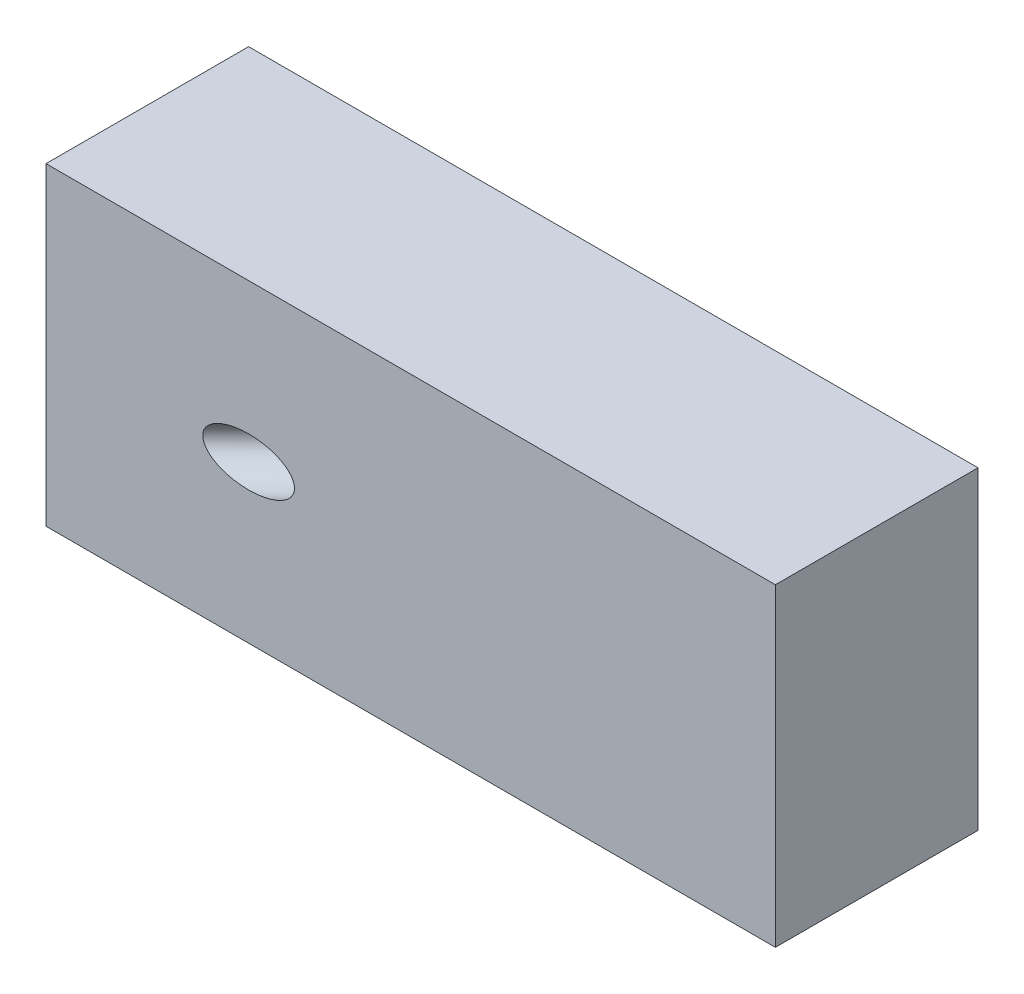
ISO-10303-21;
HEADER;
FILE_DESCRIPTION(('STEP AP214'),'2;1');
FILE_NAME('part.step','',(''),(''),'','','');
FILE_SCHEMA(('AUTOMOTIVE_DESIGN { 1 0 10303 214 1 1 1 1 }'));
ENDSEC;
DATA;
#1=APPLICATION_CONTEXT('core data for automotive mechanical design processes');
#2=APPLICATION_PROTOCOL_DEFINITION('international standard','automotive_design',2000,#1);
#3=PRODUCT_CONTEXT('',#1,'mechanical');
#4=PRODUCT('Part','Part','',(#3));
#5=PRODUCT_RELATED_PRODUCT_CATEGORY('part','',(#4));
#6=PRODUCT_DEFINITION_FORMATION('','',#4);
#7=PRODUCT_DEFINITION_CONTEXT('part definition',#1,'design');
#8=PRODUCT_DEFINITION('design','',#6,#7);
#9=PRODUCT_DEFINITION_SHAPE('','',#8);
#10=(LENGTH_UNIT() NAMED_UNIT(*) SI_UNIT(.MILLI.,.METRE.));
#11=(NAMED_UNIT(*) PLANE_ANGLE_UNIT() SI_UNIT($,.RADIAN.));
#12=(NAMED_UNIT(*) SI_UNIT($,.STERADIAN.) SOLID_ANGLE_UNIT());
#13=UNCERTAINTY_MEASURE_WITH_UNIT(LENGTH_MEASURE(1.E-05),#10,'distance_accuracy_value','');
#14=(GEOMETRIC_REPRESENTATION_CONTEXT(3) GLOBAL_UNCERTAINTY_ASSIGNED_CONTEXT((#13)) GLOBAL_UNIT_ASSIGNED_CONTEXT((#10,
#11,#12)) REPRESENTATION_CONTEXT('',''));
#15=CARTESIAN_POINT('',(0.,0.,0.));
#16=DIRECTION('',(0.,0.,1.));
#17=DIRECTION('',(1.,0.,0.));
#18=AXIS2_PLACEMENT_3D('',#15,#16,#17);
#19=CARTESIAN_POINT('',(0.,7.75,5.));
#20=DIRECTION('',(1.,0.,0.));
#21=DIRECTION('',(0.,1.,0.));
#22=AXIS2_PLACEMENT_3D('',#19,#20,#21);
#23=PLANE('',#22);
#24=DIRECTION('',(0.,-1.,0.));
#25=VECTOR('',#24,1.);
#26=CARTESIAN_POINT('',(0.,7.75,0.));
#27=LINE('',#26,#25);
#28=CARTESIAN_POINT('',(0.,7.75,0.));
#29=VERTEX_POINT('',#28);
#30=CARTESIAN_POINT('',(0.,0.,0.));
#31=VERTEX_POINT('',#30);
#32=EDGE_CURVE('E111',#29,#31,#27,.T.);
#33=ORIENTED_EDGE('',*,*,#32,.T.);
#34=DIRECTION('',(0.,0.,-1.));
#35=VECTOR('',#34,1.);
#36=CARTESIAN_POINT('',(0.,0.,5.));
#37=LINE('',#36,#35);
#38=CARTESIAN_POINT('',(0.,0.,5.));
#39=VERTEX_POINT('',#38);
#40=EDGE_CURVE('E100',#39,#31,#37,.T.);
#41=ORIENTED_EDGE('',*,*,#40,.F.);
#42=DIRECTION('',(0.,-1.,0.));
#43=VECTOR('',#42,1.);
#44=CARTESIAN_POINT('',(0.,7.75,5.));
#45=LINE('',#44,#43);
#46=CARTESIAN_POINT('',(0.,7.75,5.));
#47=VERTEX_POINT('',#46);
#48=EDGE_CURVE('E92',#47,#39,#45,.T.);
#49=ORIENTED_EDGE('',*,*,#48,.F.);
#50=DIRECTION('',(0.,0.,-1.));
#51=VECTOR('',#50,1.);
#52=CARTESIAN_POINT('',(0.,7.75,5.));
#53=LINE('',#52,#51);
#54=EDGE_CURVE('E107',#47,#29,#53,.T.);
#55=ORIENTED_EDGE('',*,*,#54,.T.);
#56=EDGE_LOOP('',(#33,#41,#49,#55));
#57=FACE_BOUND('',#56,.T.);
#58=ADVANCED_FACE('F39',(#57),#23,.F.);
#59=CARTESIAN_POINT('',(0.,0.,5.));
#60=DIRECTION('',(0.,1.,0.));
#61=DIRECTION('',(0.,0.,1.));
#62=AXIS2_PLACEMENT_3D('',#59,#60,#61);
#63=PLANE('',#62);
#64=DIRECTION('',(1.,0.,0.));
#65=VECTOR('',#64,1.);
#66=CARTESIAN_POINT('',(0.,0.,0.));
#67=LINE('',#66,#65);
#68=CARTESIAN_POINT('',(18.,0.,0.));
#69=VERTEX_POINT('',#68);
#70=EDGE_CURVE('E98',#31,#69,#67,.T.);
#71=ORIENTED_EDGE('',*,*,#70,.T.);
#72=DIRECTION('',(0.,0.,-1.));
#73=VECTOR('',#72,1.);
#74=CARTESIAN_POINT('',(18.,0.,5.));
#75=LINE('',#74,#73);
#76=CARTESIAN_POINT('',(18.,0.,5.));
#77=VERTEX_POINT('',#76);
#78=EDGE_CURVE('E96',#77,#69,#75,.T.);
#79=ORIENTED_EDGE('',*,*,#78,.F.);
#80=DIRECTION('',(1.,0.,0.));
#81=VECTOR('',#80,1.);
#82=CARTESIAN_POINT('',(0.,0.,5.));
#83=LINE('',#82,#81);
#84=EDGE_CURVE('E87',#39,#77,#83,.T.);
#85=ORIENTED_EDGE('',*,*,#84,.F.);
#86=ORIENTED_EDGE('',*,*,#40,.T.);
#87=EDGE_LOOP('',(#71,#79,#85,#86));
#88=FACE_BOUND('',#87,.T.);
#89=ADVANCED_FACE('F97',(#88),#63,.F.);
#90=CARTESIAN_POINT('',(18.,7.75,5.));
#91=DIRECTION('',(-1.,0.,0.));
#92=DIRECTION('',(0.,0.,1.));
#93=AXIS2_PLACEMENT_3D('',#90,#91,#92);
#94=PLANE('',#93);
#95=DIRECTION('',(0.,1.,0.));
#96=VECTOR('',#95,1.);
#97=CARTESIAN_POINT('',(18.,7.75,0.));
#98=LINE('',#97,#96);
#99=CARTESIAN_POINT('',(18.,7.75,0.));
#100=VERTEX_POINT('',#99);
#101=EDGE_CURVE('E73',#69,#100,#98,.T.);
#102=ORIENTED_EDGE('',*,*,#101,.T.);
#103=DIRECTION('',(0.,0.,-1.));
#104=VECTOR('',#103,1.);
#105=CARTESIAN_POINT('',(18.,7.75,5.));
#106=LINE('',#105,#104);
#107=CARTESIAN_POINT('',(18.,7.75,5.));
#108=VERTEX_POINT('',#107);
#109=EDGE_CURVE('E101',#108,#100,#106,.T.);
#110=ORIENTED_EDGE('',*,*,#109,.F.);
#111=DIRECTION('',(0.,1.,0.));
#112=VECTOR('',#111,1.);
#113=CARTESIAN_POINT('',(18.,7.75,5.));
#114=LINE('',#113,#112);
#115=EDGE_CURVE('E90',#77,#108,#114,.T.);
#116=ORIENTED_EDGE('',*,*,#115,.F.);
#117=ORIENTED_EDGE('',*,*,#78,.T.);
#118=EDGE_LOOP('',(#102,#110,#116,#117));
#119=FACE_BOUND('',#118,.T.);
#120=ADVANCED_FACE('F103',(#119),#94,.F.);
#121=CARTESIAN_POINT('',(0.,7.75,5.));
#122=DIRECTION('',(0.,-1.,0.));
#123=DIRECTION('',(1.,0.,0.));
#124=AXIS2_PLACEMENT_3D('',#121,#122,#123);
#125=PLANE('',#124);
#126=DIRECTION('',(-1.,0.,0.));
#127=VECTOR('',#126,1.);
#128=CARTESIAN_POINT('',(0.,7.75,0.));
#129=LINE('',#128,#127);
#130=EDGE_CURVE('E79',#100,#29,#129,.T.);
#131=ORIENTED_EDGE('',*,*,#130,.T.);
#132=ORIENTED_EDGE('',*,*,#54,.F.);
#133=DIRECTION('',(-1.,0.,0.));
#134=VECTOR('',#133,1.);
#135=CARTESIAN_POINT('',(0.,7.75,5.));
#136=LINE('',#135,#134);
#137=EDGE_CURVE('E56',#108,#47,#136,.T.);
#138=ORIENTED_EDGE('',*,*,#137,.F.);
#139=ORIENTED_EDGE('',*,*,#109,.T.);
#140=EDGE_LOOP('',(#131,#132,#138,#139));
#141=FACE_BOUND('',#140,.T.);
#142=ADVANCED_FACE('F186',(#141),#125,.F.);
#143=CARTESIAN_POINT('',(0.,0.,5.));
#144=DIRECTION('',(0.,0.,1.));
#145=DIRECTION('',(1.,0.,0.));
#146=AXIS2_PLACEMENT_3D('',#143,#144,#145);
#147=PLANE('',#146);
#148=CARTESIAN_POINT('',(3.86862915010152,3.875,5.));
#149=CARTESIAN_POINT('',(3.86862771781144,3.85440427053259,4.99999999999934));
#150=CARTESIAN_POINT('',(3.87064904998851,3.83381253152308,4.99999999999983));
#151=CARTESIAN_POINT('',(3.87828151289731,3.79445368255573,5.00000000000016));
#152=CARTESIAN_POINT('',(3.88369744339823,3.77564764084009,5.00000000000003));
#153=CARTESIAN_POINT('',(3.89746280961916,3.73911632220586,4.99999999999997));
#154=CARTESIAN_POINT('',(3.90581926729342,3.72139375257617,5.00000000000004));
#155=CARTESIAN_POINT('',(3.92897842389906,3.67999530683745,5.00000000000009));
#156=CARTESIAN_POINT('',(3.94500987337502,3.65701096191798,5.00000000000002));
#157=CARTESIAN_POINT('',(3.98044493349899,3.61385047591323,4.99999999999998));
#158=CARTESIAN_POINT('',(3.99985410175264,3.59367906325355,4.99999999999999));
#159=CARTESIAN_POINT('',(4.0539639237191,3.54401205277469,5.00000000000001));
#160=CARTESIAN_POINT('',(4.09060078894685,3.51663757914364,5.));
#161=CARTESIAN_POINT('',(4.15656576453623,3.47444070244602,5.));
#162=CARTESIAN_POINT('',(4.18506856237652,3.45824975928616,5.));
#163=CARTESIAN_POINT('',(4.24339737797011,3.4283896871433,5.));
#164=CARTESIAN_POINT('',(4.27322454862745,3.41472281102097,5.00000000000001));
#165=CARTESIAN_POINT('',(4.36388323284515,3.37715299400843,4.99999999999998));
#166=CARTESIAN_POINT('',(4.42608904977915,3.35656302242009,4.9999999999999));
#167=CARTESIAN_POINT('',(4.55231662856689,3.32270262575681,5.00000000000009));
#168=CARTESIAN_POINT('',(4.61633691612691,3.30942642776105,5.00000000000036));
#169=CARTESIAN_POINT('',(4.74534589598778,3.28931121436708,5.00000000000038));
#170=CARTESIAN_POINT('',(4.81033425711425,3.28247004670977,5.00000000000013));
#171=CARTESIAN_POINT('',(4.94064690133433,3.27481893222654,4.99999999999987));
#172=CARTESIAN_POINT('',(5.00597114349214,3.27400826708225,4.99999999999987));
#173=CARTESIAN_POINT('',(5.13642676433502,3.27837032045173,5.00000000000013));
#174=CARTESIAN_POINT('',(5.20155813759386,3.28354320573447,5.0000000000004));
#175=CARTESIAN_POINT('',(5.33104292220161,3.30017229572099,4.99999999999959));
#176=CARTESIAN_POINT('',(5.39539618331134,3.31162969465698,4.99999999999851));
#177=CARTESIAN_POINT('',(5.52253558881927,3.34154802783353,4.99999999999854));
#178=CARTESIAN_POINT('',(5.58532098308163,3.360012248521,4.99999999999965));
#179=CARTESIAN_POINT('',(5.69766267867394,3.40150761574939,5.0000000000003));
#180=CARTESIAN_POINT('',(5.747677404853,3.42326139800653,5.00000000000007));
#181=CARTESIAN_POINT('',(5.83371340200536,3.46842031128329,4.99999999999995));
#182=CARTESIAN_POINT('',(5.87043663553532,3.49047262408321,4.99999999999999));
#183=CARTESIAN_POINT('',(5.9402090169547,3.53984730526338,5.00000000000001));
#184=CARTESIAN_POINT('',(5.97326668048278,3.56715703774548,4.99999999999999));
#185=CARTESIAN_POINT('',(6.01988856892462,3.61458293326345,4.99999999999999));
#186=CARTESIAN_POINT('',(6.03561982495067,3.63255938354888,5.));
#187=CARTESIAN_POINT('',(6.0643879335086,3.67058679653031,5.));
#188=CARTESIAN_POINT('',(6.07742635071322,3.69063654431581,5.));
#189=CARTESIAN_POINT('',(6.09801430591019,3.72923363502214,5.));
#190=CARTESIAN_POINT('',(6.10611433831836,3.74748387936195,5.));
#191=CARTESIAN_POINT('',(6.11916285947115,3.78505400063874,5.));
#192=CARTESIAN_POINT('',(6.12411895482478,3.80437117202148,5.));
#193=CARTESIAN_POINT('',(6.13045145380992,3.84373875366441,5.));
#194=CARTESIAN_POINT('',(6.13180220850752,3.86379339404008,5.));
#195=CARTESIAN_POINT('',(6.13069640141744,3.90379598556343,5.));
#196=CARTESIAN_POINT('',(6.12823986229652,3.92374393734558,4.99999999999999));
#197=CARTESIAN_POINT('',(6.12020780210247,3.96093845888433,5.00000000000001));
#198=CARTESIAN_POINT('',(6.11496098384768,3.9782583681045,5.00000000000004));
#199=CARTESIAN_POINT('',(6.10198015020035,4.01195951213336,4.99999999999996));
#200=CARTESIAN_POINT('',(6.09424133943025,4.02833886482123,4.99999999999987));
#201=CARTESIAN_POINT('',(6.07201867173172,4.0684484456387,4.99999999999981));
#202=CARTESIAN_POINT('',(6.0561438021196,4.09140643561869,4.99999999999995));
#203=CARTESIAN_POINT('',(6.02101346199726,4.13453866322175,5.00000000000005));
#204=CARTESIAN_POINT('',(6.00175130712747,4.15470725307434,5.00000000000002));
#205=CARTESIAN_POINT('',(5.94811577371452,4.20429238214489,4.99999999999998));
#206=CARTESIAN_POINT('',(5.91181859821304,4.23161687682577,4.99999999999999));
#207=CARTESIAN_POINT('',(5.84644823598127,4.27376124379923,5.00000000000001));
#208=CARTESIAN_POINT('',(5.81820087067007,4.28993956283922,5.));
#209=CARTESIAN_POINT('',(5.76038262748319,4.31979635621714,5.));
#210=CARTESIAN_POINT('',(5.73081057714239,4.33347255927505,4.99999999999999));
#211=CARTESIAN_POINT('',(5.64091415059498,4.37109798415276,5.00000000000002));
#212=CARTESIAN_POINT('',(5.57921354686625,4.39176209757105,5.00000000000011));
#213=CARTESIAN_POINT('',(5.45398565843377,4.4258358913377,4.9999999999999));
#214=CARTESIAN_POINT('',(5.39045986274137,4.43925131765937,4.99999999999959));
#215=CARTESIAN_POINT('',(5.26242563069303,4.45971105140421,4.99999999999958));
#216=CARTESIAN_POINT('',(5.19791753369751,4.46675751054957,4.99999999999987));
#217=CARTESIAN_POINT('',(5.06854590464182,4.47489280424284,5.00000000000013));
#218=CARTESIAN_POINT('',(5.00368241751442,4.47598237529405,5.00000000000011));
#219=CARTESIAN_POINT('',(4.87411689140049,4.47226638487764,4.99999999999989));
#220=CARTESIAN_POINT('',(4.80941485571514,4.46746070384405,4.9999999999997));
#221=CARTESIAN_POINT('',(4.6807469611195,4.45168141288176,5.00000000000031));
#222=CARTESIAN_POINT('',(4.61678123310498,4.44070672303541,5.00000000000112));
#223=CARTESIAN_POINT('',(4.49031059836946,4.4119099819334,5.00000000000106));
#224=CARTESIAN_POINT('',(4.4278063392799,4.39408495383538,5.0000000000002));
#225=CARTESIAN_POINT('',(4.33617824422928,4.36125600296638,4.9999999999999));
#226=CARTESIAN_POINT('',(4.30596394471828,4.349284214991,4.99999999999997));
#227=CARTESIAN_POINT('',(4.24654727385538,4.32305970892369,5.00000000000003));
#228=CARTESIAN_POINT('',(4.21734485460437,4.30880709897838,5.00000000000001));
#229=CARTESIAN_POINT('',(4.14699805246767,4.27044314000949,4.99999999999998));
#230=CARTESIAN_POINT('',(4.10662224158329,4.24483087720328,4.99999999999998));
#231=CARTESIAN_POINT('',(4.05465874401162,4.20489346376582,5.));
#232=CARTESIAN_POINT('',(4.04081211373804,4.19348212893077,5.00000000000001));
#233=CARTESIAN_POINT('',(4.01402363610118,4.1695794615998,4.99999999999999));
#234=CARTESIAN_POINT('',(4.00108392666865,4.15708572279586,4.99999999999996));
#235=CARTESIAN_POINT('',(3.96903555987251,4.12320597504996,5.00000000000006));
#236=CARTESIAN_POINT('',(3.95082471758196,4.10094398456574,5.00000000000029));
#237=CARTESIAN_POINT('',(3.9188130933924,4.05348516535344,4.99999999999971));
#238=CARTESIAN_POINT('',(3.90499340873262,4.02830157122629,4.9999999999989));
#239=CARTESIAN_POINT('',(3.88616261780664,3.98214143524395,5.00000000000083));
#240=CARTESIAN_POINT('',(3.87980595805228,3.96171992174369,5.00000000000272));
#241=CARTESIAN_POINT('',(3.87096284855341,3.91921969519198,5.00000000000273));
#242=CARTESIAN_POINT('',(3.86863068752815,3.89710754869873,5.0000000000007));
#243=CARTESIAN_POINT('',(3.86862915010152,3.875,5.));
#244=B_SPLINE_CURVE_WITH_KNOTS('',3,(#148,#149,#150,#151,#152,#153,#154,#155,#156,#157,#158,
#159,#160,#161,#162,#163,#164,#165,#166,#167,#168,#169,#170,#171,#172,#173,#174,#175,#176,#177,
#178,#179,#180,#181,#182,#183,#184,#185,#186,#187,#188,#189,#190,#191,#192,#193,#194,#195,#196,
#197,#198,#199,#200,#201,#202,#203,#204,#205,#206,#207,#208,#209,#210,#211,#212,#213,#214,#215,
#216,#217,#218,#219,#220,#221,#222,#223,#224,#225,#226,#227,#228,#229,#230,#231,#232,#233,#234,
#235,#236,#237,#238,#239,#240,#241,#242,#243),.UNSPECIFIED.,.T.,.F.,(4,2,2,2,2,2,2,2,2,2,2,2,2,
2,2,2,2,2,2,2,2,2,2,2,2,2,2,2,2,2,2,2,2,2,2,2,2,2,2,2,2,2,2,2,2,2,2,4),(0.,0.0616871998823941,
0.120116930941494,0.178687149331705,0.262281226560215,0.346014170563411,0.482443287356364,
0.580678102179316,0.679000177341814,0.874962889227487,1.07077070103948,1.26651299969528,
1.4622319822944,1.65795641995553,1.85371806358937,2.04957164006456,2.21272243142616,
2.34091145280605,2.46879614147404,2.540277227319,2.6117166615307,2.67138059668041,
2.73089962155164,2.79084095895341,2.85078193949527,2.90485786161377,2.9590384709791,
3.04229480187453,3.12571731054712,3.261245724081,3.35879682609658,3.45643604484919,
3.65103568890563,3.84548084830786,4.03986029085041,4.23421569998137,4.4285750510431,
4.62296843633826,4.81744639176348,4.91486144495557,5.01227188051831,5.15502480704984,
5.2088092776206,5.26271654599943,5.34862465900622,5.43415778668831,5.49797671240445,
5.56419203037346),.UNSPECIFIED.);
#245=CARTESIAN_POINT('',(3.86862915010152,3.875,5.));
#246=VERTEX_POINT('',#245);
#247=EDGE_CURVE('E115',#246,#246,#244,.T.);
#248=ORIENTED_EDGE('',*,*,#247,.F.);
#249=EDGE_LOOP('',(#248));
#250=FACE_BOUND('',#249,.T.);
#251=ORIENTED_EDGE('',*,*,#48,.T.);
#252=ORIENTED_EDGE('',*,*,#84,.T.);
#253=ORIENTED_EDGE('',*,*,#115,.T.);
#254=ORIENTED_EDGE('',*,*,#137,.T.);
#255=EDGE_LOOP('',(#251,#252,#253,#254));
#256=FACE_BOUND('',#255,.T.);
#257=ADVANCED_FACE('F88',(#250,#256),#147,.T.);
#258=CARTESIAN_POINT('',(0.,0.,0.));
#259=DIRECTION('',(0.,0.,1.));
#260=DIRECTION('',(1.,0.,0.));
#261=AXIS2_PLACEMENT_3D('',#258,#259,#260);
#262=PLANE('',#261);
#263=CARTESIAN_POINT('',(11.7292361250002,2.125,0.));
#264=DIRECTION('',(0.,0.,1.));
#265=DIRECTION('',(1.,0.,0.));
#266=AXIS2_PLACEMENT_3D('',#263,#264,#265);
#267=CIRCLE('',#266,0.25);
#268=CARTESIAN_POINT('',(11.9792361250002,2.125,0.));
#269=VERTEX_POINT('',#268);
#270=EDGE_CURVE('E11',#269,#269,#267,.F.);
#271=ORIENTED_EDGE('',*,*,#270,.F.);
#272=EDGE_LOOP('',(#271));
#273=FACE_BOUND('',#272,.T.);
#274=CARTESIAN_POINT('',(11.7292361250002,5.625,0.));
#275=DIRECTION('',(0.,0.,1.));
#276=DIRECTION('',(1.,0.,0.));
#277=AXIS2_PLACEMENT_3D('',#274,#275,#276);
#278=CIRCLE('',#277,0.25);
#279=CARTESIAN_POINT('',(11.9792361250002,5.625,0.));
#280=VERTEX_POINT('',#279);
#281=EDGE_CURVE('E48',#280,#280,#278,.F.);
#282=ORIENTED_EDGE('',*,*,#281,.F.);
#283=EDGE_LOOP('',(#282));
#284=FACE_BOUND('',#283,.T.);
#285=CARTESIAN_POINT('',(8.86862915010152,3.875,0.));
#286=CARTESIAN_POINT('',(8.86862771781143,3.85440427053259,-6.5479621180761E-13));
#287=CARTESIAN_POINT('',(8.87064904998851,3.83381253152308,-1.67269497313426E-13));
#288=CARTESIAN_POINT('',(8.87828151289731,3.79445368255573,1.58436624794894E-13));
#289=CARTESIAN_POINT('',(8.88369744339823,3.77564764084009,0.));
#290=CARTESIAN_POINT('',(8.89746280961916,3.73911632220586,0.));
#291=CARTESIAN_POINT('',(8.90581926729342,3.72139375257617,0.));
#292=CARTESIAN_POINT('',(8.92897842389906,3.67999530683745,0.));
#293=CARTESIAN_POINT('',(8.94500987337502,3.65701096191798,0.));
#294=CARTESIAN_POINT('',(8.98044493349899,3.61385047591323,0.));
#295=CARTESIAN_POINT('',(8.99985410175264,3.59367906325355,0.));
#296=CARTESIAN_POINT('',(9.0539639237191,3.54401205277469,0.));
#297=CARTESIAN_POINT('',(9.09060078894685,3.51663757914364,0.));
#298=CARTESIAN_POINT('',(9.15656576453623,3.47444070244602,0.));
#299=CARTESIAN_POINT('',(9.18506856237652,3.45824975928616,0.));
#300=CARTESIAN_POINT('',(9.24339737797012,3.4283896871433,0.));
#301=CARTESIAN_POINT('',(9.27322454862745,3.41472281102097,0.));
#302=CARTESIAN_POINT('',(9.36388323284515,3.37715299400843,0.));
#303=CARTESIAN_POINT('',(9.42608904977915,3.35656302242009,0.));
#304=CARTESIAN_POINT('',(9.55231662856689,3.32270262575681,0.));
#305=CARTESIAN_POINT('',(9.61633691612691,3.30942642776104,3.6415488403388E-13));
#306=CARTESIAN_POINT('',(9.74534589598778,3.28931121436707,3.78304396224251E-13));
#307=CARTESIAN_POINT('',(9.81033425711425,3.28247004670977,1.2385126040534E-13));
#308=CARTESIAN_POINT('',(9.94064690133434,3.27481893222654,-1.30774988364794E-13));
#309=CARTESIAN_POINT('',(10.0059711434921,3.27400826708225,-1.30978386546999E-13));
#310=CARTESIAN_POINT('',(10.136426764335,3.27837032045173,1.30982037164892E-13));
#311=CARTESIAN_POINT('',(10.2015581375939,3.28354320573447,3.93153171734876E-13));
#312=CARTESIAN_POINT('',(10.3310429222016,3.30017229572099,-4.14046567927456E-13));
#313=CARTESIAN_POINT('',(10.3953961833113,3.31162969465698,-1.48367056931383E-12));
#314=CARTESIAN_POINT('',(10.5225355888193,3.34154802783353,-1.45147399379676E-12));
#315=CARTESIAN_POINT('',(10.5853209830816,3.36001224852101,-3.48633435423833E-13));
#316=CARTESIAN_POINT('',(10.6976626786739,3.4015076157494,2.96779709313103E-13));
#317=CARTESIAN_POINT('',(10.747677404853,3.42326139800653,0.));
#318=CARTESIAN_POINT('',(10.8337134020054,3.46842031128329,0.));
#319=CARTESIAN_POINT('',(10.8704366355353,3.49047262408322,0.));
#320=CARTESIAN_POINT('',(10.9402090169547,3.53984730526338,0.));
#321=CARTESIAN_POINT('',(10.9732666804828,3.56715703774548,0.));
#322=CARTESIAN_POINT('',(11.0198885689246,3.61458293326345,0.));
#323=CARTESIAN_POINT('',(11.0356198249507,3.63255938354888,0.));
#324=CARTESIAN_POINT('',(11.0643879335086,3.67058679653031,0.));
#325=CARTESIAN_POINT('',(11.0774263507132,3.69063654431581,0.));
#326=CARTESIAN_POINT('',(11.0980143059102,3.72923363502215,0.));
#327=CARTESIAN_POINT('',(11.1061143383184,3.74748387936196,0.));
#328=CARTESIAN_POINT('',(11.1191628594711,3.78505400063875,0.));
#329=CARTESIAN_POINT('',(11.1241189548248,3.80437117202149,0.));
#330=CARTESIAN_POINT('',(11.1304514538099,3.84373875366441,0.));
#331=CARTESIAN_POINT('',(11.1318022085075,3.86379339404008,0.));
#332=CARTESIAN_POINT('',(11.1306964014174,3.90379598556344,0.));
#333=CARTESIAN_POINT('',(11.1282398622965,3.92374393734558,0.));
#334=CARTESIAN_POINT('',(11.1202078021025,3.96093845888433,0.));
#335=CARTESIAN_POINT('',(11.1149609838477,3.97825836810451,0.));
#336=CARTESIAN_POINT('',(11.1019801502003,4.01195951213336,0.));
#337=CARTESIAN_POINT('',(11.0942413394303,4.02833886482123,-1.30010710124403E-13));
#338=CARTESIAN_POINT('',(11.0720186717317,4.0684484456387,-1.87452910732065E-13));
#339=CARTESIAN_POINT('',(11.0561438021196,4.09140643561869,0.));
#340=CARTESIAN_POINT('',(11.0210134619973,4.13453866322175,0.));
#341=CARTESIAN_POINT('',(11.0017513071275,4.15470725307434,0.));
#342=CARTESIAN_POINT('',(10.9481157737145,4.20429238214489,0.));
#343=CARTESIAN_POINT('',(10.911818598213,4.23161687682577,0.));
#344=CARTESIAN_POINT('',(10.8464482359813,4.27376124379923,0.));
#345=CARTESIAN_POINT('',(10.8182008706701,4.28993956283923,0.));
#346=CARTESIAN_POINT('',(10.7603826274832,4.31979635621714,0.));
#347=CARTESIAN_POINT('',(10.7308105771424,4.33347255927505,0.));
#348=CARTESIAN_POINT('',(10.640914150595,4.37109798415276,0.));
#349=CARTESIAN_POINT('',(10.5792135468662,4.39176209757105,1.06948254897137E-13));
#350=CARTESIAN_POINT('',(10.4539856584338,4.4258358913377,-1.06863353075986E-13));
#351=CARTESIAN_POINT('',(10.3904598627414,4.43925131765937,-4.06885500783275E-13));
#352=CARTESIAN_POINT('',(10.262425630693,4.45971105140421,-4.18840853157963E-13));
#353=CARTESIAN_POINT('',(10.1979175336975,4.46675751054957,-1.30972780668668E-13));
#354=CARTESIAN_POINT('',(10.0685459046418,4.47489280424284,1.30956586966797E-13));
#355=CARTESIAN_POINT('',(10.0036824175144,4.47598237529405,1.05056677326726E-13));
#356=CARTESIAN_POINT('',(9.87411689140048,4.47226638487764,-1.11997772365498E-13));
#357=CARTESIAN_POINT('',(9.80941485571513,4.46746070384405,-3.03155664113611E-13));
#358=CARTESIAN_POINT('',(9.68074696111949,4.45168141288175,3.10148251089395E-13));
#359=CARTESIAN_POINT('',(9.61678123310497,4.44070672303541,1.11478440670087E-12));
#360=CARTESIAN_POINT('',(9.49031059836945,4.4119099819334,1.05707683521823E-12));
#361=CARTESIAN_POINT('',(9.42780633927989,4.39408495383537,1.94007742343815E-13));
#362=CARTESIAN_POINT('',(9.33617824422927,4.36125600296637,0.));
#363=CARTESIAN_POINT('',(9.30596394471827,4.349284214991,0.));
#364=CARTESIAN_POINT('',(9.24654727385537,4.32305970892368,0.));
#365=CARTESIAN_POINT('',(9.21734485460436,4.30880709897837,0.));
#366=CARTESIAN_POINT('',(9.14699805246765,4.27044314000949,0.));
#367=CARTESIAN_POINT('',(9.10662224158328,4.24483087720327,0.));
#368=CARTESIAN_POINT('',(9.05465874401161,4.20489346376582,0.));
#369=CARTESIAN_POINT('',(9.04081211373804,4.19348212893077,0.));
#370=CARTESIAN_POINT('',(9.01402363610118,4.16957946159979,0.));
#371=CARTESIAN_POINT('',(9.00108392666865,4.15708572279585,0.));
#372=CARTESIAN_POINT('',(8.9690355598725,4.12320597504996,0.));
#373=CARTESIAN_POINT('',(8.95082471758196,4.10094398456574,2.92254577608635E-13));
#374=CARTESIAN_POINT('',(8.9188130933924,4.05348516535344,-2.90978898585473E-13));
#375=CARTESIAN_POINT('',(8.90499340873262,4.02830157122628,-1.09993155156908E-12));
#376=CARTESIAN_POINT('',(8.88616261780664,3.98214143524395,8.26751235751569E-13));
#377=CARTESIAN_POINT('',(8.87980595805228,3.96171992174369,2.71466248985615E-12));
#378=CARTESIAN_POINT('',(8.87096284855341,3.91921969519197,2.72563249631167E-12));
#379=CARTESIAN_POINT('',(8.86863068752815,3.89710754869873,7.04659592310698E-13));
#380=CARTESIAN_POINT('',(8.86862915010152,3.875,0.));
#381=B_SPLINE_CURVE_WITH_KNOTS('',3,(#285,#286,#287,#288,#289,#290,#291,#292,#293,#294,#295,
#296,#297,#298,#299,#300,#301,#302,#303,#304,#305,#306,#307,#308,#309,#310,#311,#312,#313,#314,
#315,#316,#317,#318,#319,#320,#321,#322,#323,#324,#325,#326,#327,#328,#329,#330,#331,#332,#333,
#334,#335,#336,#337,#338,#339,#340,#341,#342,#343,#344,#345,#346,#347,#348,#349,#350,#351,#352,
#353,#354,#355,#356,#357,#358,#359,#360,#361,#362,#363,#364,#365,#366,#367,#368,#369,#370,#371,
#372,#373,#374,#375,#376,#377,#378,#379,#380),.UNSPECIFIED.,.T.,.F.,(4,2,2,2,2,2,2,2,2,2,2,2,2,
2,2,2,2,2,2,2,2,2,2,2,2,2,2,2,2,2,2,2,2,2,2,2,2,2,2,2,2,2,2,2,2,2,2,4),(0.,0.0616871998823934,
0.120116930941494,0.178687149331704,0.262281226560216,0.346014170563414,0.482443287356364,
0.580678102179318,0.679000177341816,0.874962889227493,1.07077070103949,1.26651299969529,
1.46223198229441,1.65795641995554,1.85371806358939,2.04957164006457,2.21272243142616,
2.34091145280606,2.46879614147404,2.54027722731901,2.6117166615307,2.67138059668041,
2.73089962155165,2.79084095895342,2.85078193949527,2.90485786161378,2.9590384709791,
3.04229480187453,3.12571731054713,3.26124572408101,3.35879682609659,3.4564360448492,
3.65103568890564,3.84548084830787,4.03986029085041,4.23421569998138,4.42857505104311,
4.62296843633827,4.81744639176349,4.91486144495558,5.01227188051833,5.15502480704985,
5.20880927762061,5.26271654599943,5.34862465900623,5.43415778668831,5.49797671240446,
5.56419203037346),.UNSPECIFIED.);
#382=CARTESIAN_POINT('',(8.86862915010152,3.875,0.));
#383=VERTEX_POINT('',#382);
#384=EDGE_CURVE('E128',#383,#383,#381,.T.);
#385=ORIENTED_EDGE('',*,*,#384,.T.);
#386=EDGE_LOOP('',(#385));
#387=FACE_BOUND('',#386,.T.);
#388=ORIENTED_EDGE('',*,*,#32,.F.);
#389=ORIENTED_EDGE('',*,*,#130,.F.);
#390=ORIENTED_EDGE('',*,*,#101,.F.);
#391=ORIENTED_EDGE('',*,*,#70,.F.);
#392=EDGE_LOOP('',(#388,#389,#390,#391));
#393=FACE_BOUND('',#392,.T.);
#394=ADVANCED_FACE('F137',(#273,#284,#387,#393),#262,.F.);
#395=CARTESIAN_POINT('',(-2.07106781186548,3.875,12.0710678118655));
#396=DIRECTION('',(0.707106781186547,0.,-0.707106781186548));
#397=DIRECTION('',(-0.707106781186548,0.,-0.707106781186547));
#398=AXIS2_PLACEMENT_3D('',#395,#396,#397);
#399=ELLIPSE('',#398,0.8,0.6);
#400=DIRECTION('',(0.707106781186547,0.,-0.707106781186548));
#401=VECTOR('',#400,1.);
#402=SURFACE_OF_LINEAR_EXTRUSION('',#399,#401);
#403=ORIENTED_EDGE('',*,*,#247,.T.);
#404=EDGE_LOOP('',(#403));
#405=FACE_BOUND('',#404,.T.);
#406=ORIENTED_EDGE('',*,*,#384,.F.);
#407=EDGE_LOOP('',(#406));
#408=FACE_BOUND('',#407,.T.);
#409=ADVANCED_FACE('F141',(#405,#408),#402,.F.);
#410=CARTESIAN_POINT('',(11.7292361250002,5.625,-0.5));
#411=DIRECTION('',(0.,0.,1.));
#412=DIRECTION('',(1.,0.,0.));
#413=AXIS2_PLACEMENT_3D('',#410,#411,#412);
#414=CYLINDRICAL_SURFACE('',#413,0.25);
#415=CARTESIAN_POINT('',(11.7292361250002,5.625,-0.5));
#416=DIRECTION('',(0.,0.,-1.));
#417=DIRECTION('',(-1.,0.,0.));
#418=AXIS2_PLACEMENT_3D('',#415,#416,#417);
#419=CIRCLE('',#418,0.25);
#420=CARTESIAN_POINT('',(11.4792361250002,5.625,-0.5));
#421=VERTEX_POINT('',#420);
#422=EDGE_CURVE('E136',#421,#421,#419,.T.);
#423=ORIENTED_EDGE('',*,*,#422,.F.);
#424=EDGE_LOOP('',(#423));
#425=FACE_BOUND('',#424,.T.);
#426=ORIENTED_EDGE('',*,*,#281,.T.);
#427=EDGE_LOOP('',(#426));
#428=FACE_BOUND('',#427,.T.);
#429=ADVANCED_FACE('F146',(#425,#428),#414,.T.);
#430=CARTESIAN_POINT('',(11.7292361250002,5.625,-0.5));
#431=DIRECTION('',(0.,0.,-1.));
#432=DIRECTION('',(-1.,0.,0.));
#433=AXIS2_PLACEMENT_3D('',#430,#431,#432);
#434=PLANE('',#433);
#435=ORIENTED_EDGE('',*,*,#422,.T.);
#436=EDGE_LOOP('',(#435));
#437=FACE_BOUND('',#436,.T.);
#438=ADVANCED_FACE('F173',(#437),#434,.T.);
#439=CARTESIAN_POINT('',(11.7292361250002,2.125,-0.5));
#440=DIRECTION('',(0.,0.,1.));
#441=DIRECTION('',(1.,0.,0.));
#442=AXIS2_PLACEMENT_3D('',#439,#440,#441);
#443=CYLINDRICAL_SURFACE('',#442,0.25);
#444=CARTESIAN_POINT('',(11.7292361250002,2.125,-0.5));
#445=DIRECTION('',(0.,0.,-1.));
#446=DIRECTION('',(-1.,0.,0.));
#447=AXIS2_PLACEMENT_3D('',#444,#445,#446);
#448=CIRCLE('',#447,0.25);
#449=CARTESIAN_POINT('',(11.4792361250002,2.125,-0.5));
#450=VERTEX_POINT('',#449);
#451=EDGE_CURVE('E164',#450,#450,#448,.T.);
#452=ORIENTED_EDGE('',*,*,#451,.F.);
#453=EDGE_LOOP('',(#452));
#454=FACE_BOUND('',#453,.T.);
#455=ORIENTED_EDGE('',*,*,#270,.T.);
#456=EDGE_LOOP('',(#455));
#457=FACE_BOUND('',#456,.T.);
#458=ADVANCED_FACE('F170',(#454,#457),#443,.T.);
#459=CARTESIAN_POINT('',(11.7292361250002,2.125,-0.5));
#460=DIRECTION('',(0.,0.,-1.));
#461=DIRECTION('',(-1.,0.,0.));
#462=AXIS2_PLACEMENT_3D('',#459,#460,#461);
#463=PLANE('',#462);
#464=ORIENTED_EDGE('',*,*,#451,.T.);
#465=EDGE_LOOP('',(#464));
#466=FACE_BOUND('',#465,.T.);
#467=ADVANCED_FACE('F168',(#466),#463,.T.);
#468=CLOSED_SHELL('',(#58,#89,#120,#142,#257,#394,#409,#429,#438,#458,#467));
#469=MANIFOLD_SOLID_BREP('B2',#468);
#470=ADVANCED_BREP_SHAPE_REPRESENTATION('',(#18,#469),#14);
#471=SHAPE_DEFINITION_REPRESENTATION(#9,#470);
ENDSEC;
END-ISO-10303-21;
